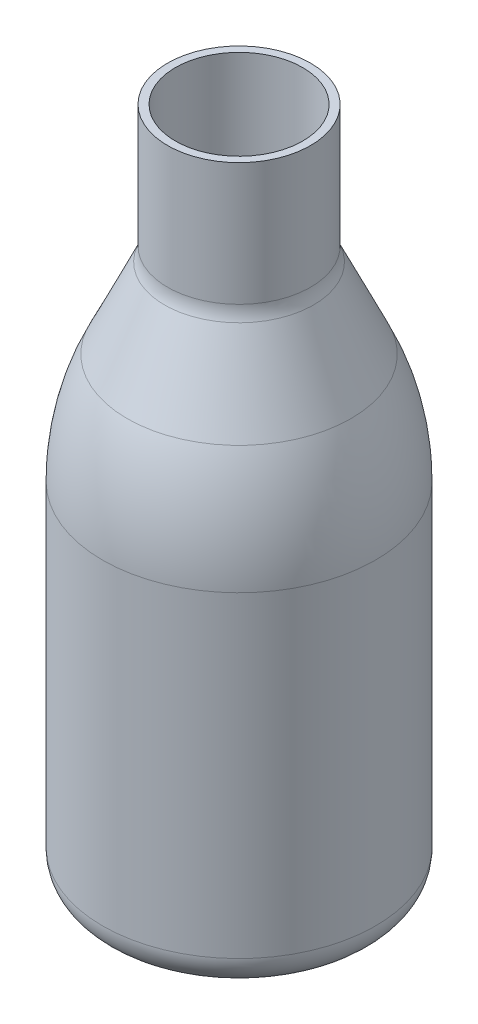
ISO-10303-21;
HEADER;
FILE_DESCRIPTION(('STEP AP214'),'2;1');
FILE_NAME('part.step','',(''),(''),'','','');
FILE_SCHEMA(('AUTOMOTIVE_DESIGN { 1 0 10303 214 1 1 1 1 }'));
ENDSEC;
DATA;
#1=APPLICATION_CONTEXT('core data for automotive mechanical design processes');
#2=APPLICATION_PROTOCOL_DEFINITION('international standard','automotive_design',2000,#1);
#3=PRODUCT_CONTEXT('',#1,'mechanical');
#4=PRODUCT('Part','Part','',(#3));
#5=PRODUCT_RELATED_PRODUCT_CATEGORY('part','',(#4));
#6=PRODUCT_DEFINITION_FORMATION('','',#4);
#7=PRODUCT_DEFINITION_CONTEXT('part definition',#1,'design');
#8=PRODUCT_DEFINITION('design','',#6,#7);
#9=PRODUCT_DEFINITION_SHAPE('','',#8);
#10=(LENGTH_UNIT() NAMED_UNIT(*) SI_UNIT(.MILLI.,.METRE.));
#11=(NAMED_UNIT(*) PLANE_ANGLE_UNIT() SI_UNIT($,.RADIAN.));
#12=(NAMED_UNIT(*) SI_UNIT($,.STERADIAN.) SOLID_ANGLE_UNIT());
#13=UNCERTAINTY_MEASURE_WITH_UNIT(LENGTH_MEASURE(1.E-05),#10,'distance_accuracy_value','');
#14=(GEOMETRIC_REPRESENTATION_CONTEXT(3) GLOBAL_UNCERTAINTY_ASSIGNED_CONTEXT((#13)) GLOBAL_UNIT_ASSIGNED_CONTEXT((#10,
#11,#12)) REPRESENTATION_CONTEXT('',''));
#15=CARTESIAN_POINT('',(0.,0.,0.));
#16=DIRECTION('',(0.,0.,1.));
#17=DIRECTION('',(1.,0.,0.));
#18=AXIS2_PLACEMENT_3D('',#15,#16,#17);
#19=CARTESIAN_POINT('',(0.,0.,0.));
#20=DIRECTION('',(0.,1.,0.));
#21=DIRECTION('',(0.,0.,1.));
#22=AXIS2_PLACEMENT_3D('',#19,#20,#21);
#23=PLANE('',#22);
#24=CARTESIAN_POINT('',(0.,0.,0.));
#25=DIRECTION('',(0.,1.,0.));
#26=DIRECTION('',(0.,0.,1.));
#27=AXIS2_PLACEMENT_3D('',#24,#25,#26);
#28=CIRCLE('',#27,20.32);
#29=CARTESIAN_POINT('',(0.,0.,20.32));
#30=VERTEX_POINT('',#29);
#31=EDGE_CURVE('E46',#30,#30,#28,.F.);
#32=ORIENTED_EDGE('',*,*,#31,.T.);
#33=EDGE_LOOP('',(#32));
#34=FACE_BOUND('',#33,.T.);
#35=ADVANCED_FACE('F31',(#34),#23,.F.);
#36=CARTESIAN_POINT('',(0.,0.,0.));
#37=DIRECTION('',(0.,-1.,0.));
#38=DIRECTION('',(0.,0.,-1.));
#39=AXIS2_PLACEMENT_3D('',#36,#37,#38);
#40=CYLINDRICAL_SURFACE('',#39,26.67);
#41=CARTESIAN_POINT('',(0.,68.2635948565817,0.));
#42=DIRECTION('',(0.,1.,0.));
#43=DIRECTION('',(0.,0.,1.));
#44=AXIS2_PLACEMENT_3D('',#41,#42,#43);
#45=CIRCLE('',#44,26.67);
#46=CARTESIAN_POINT('',(0.,68.2635948565817,26.67));
#47=VERTEX_POINT('',#46);
#48=EDGE_CURVE('E38',#47,#47,#45,.F.);
#49=ORIENTED_EDGE('',*,*,#48,.T.);
#50=EDGE_LOOP('',(#49));
#51=FACE_BOUND('',#50,.T.);
#52=CARTESIAN_POINT('',(0.,6.35,0.));
#53=DIRECTION('',(0.,1.,0.));
#54=DIRECTION('',(0.,0.,1.));
#55=AXIS2_PLACEMENT_3D('',#52,#53,#54);
#56=CIRCLE('',#55,26.67);
#57=CARTESIAN_POINT('',(0.,6.35,26.67));
#58=VERTEX_POINT('',#57);
#59=EDGE_CURVE('E42',#58,#58,#56,.T.);
#60=ORIENTED_EDGE('',*,*,#59,.T.);
#61=EDGE_LOOP('',(#60));
#62=FACE_BOUND('',#61,.T.);
#63=ADVANCED_FACE('F98',(#51,#62),#40,.T.);
#64=CARTESIAN_POINT('',(0.,106.68,0.));
#65=DIRECTION('',(0.,-1.,0.));
#66=DIRECTION('',(0.,0.,-1.));
#67=AXIS2_PLACEMENT_3D('',#64,#65,#66);
#68=CONICAL_SURFACE('',#67,13.97,0.438164188023194);
#69=CARTESIAN_POINT('',(0.,89.816906807428,0.));
#70=DIRECTION('',(0.,1.,0.));
#71=DIRECTION('',(0.,0.,1.));
#72=AXIS2_PLACEMENT_3D('',#69,#70,#71);
#73=CIRCLE('',#72,21.8710298140108);
#74=CARTESIAN_POINT('',(0.,89.816906807428,21.8710298140108));
#75=VERTEX_POINT('',#74);
#76=EDGE_CURVE('E10',#75,#75,#73,.T.);
#77=ORIENTED_EDGE('',*,*,#76,.T.);
#78=EDGE_LOOP('',(#77));
#79=FACE_BOUND('',#78,.T.);
#80=CARTESIAN_POINT('',(0.,105.399700415963,0.));
#81=DIRECTION('',(0.,-1.,0.));
#82=DIRECTION('',(0.,0.,-1.));
#83=AXIS2_PLACEMENT_3D('',#80,#81,#82);
#84=CIRCLE('',#83,14.5698712732487);
#85=CARTESIAN_POINT('',(0.,105.399700415963,-14.5698712732487));
#86=VERTEX_POINT('',#85);
#87=EDGE_CURVE('E54',#86,#86,#84,.T.);
#88=ORIENTED_EDGE('',*,*,#87,.T.);
#89=EDGE_LOOP('',(#88));
#90=FACE_BOUND('',#89,.T.);
#91=ADVANCED_FACE('F104',(#79,#90),#68,.T.);
#92=CARTESIAN_POINT('',(0.,0.,0.));
#93=DIRECTION('',(0.,-1.,0.));
#94=DIRECTION('',(0.,0.,-1.));
#95=AXIS2_PLACEMENT_3D('',#92,#93,#94);
#96=CYLINDRICAL_SURFACE('',#95,13.97);
#97=CARTESIAN_POINT('',(0.,108.093864409819,0.));
#98=DIRECTION('',(0.,-1.,0.));
#99=DIRECTION('',(0.,0.,-1.));
#100=AXIS2_PLACEMENT_3D('',#97,#98,#99);
#101=CIRCLE('',#100,13.97);
#102=CARTESIAN_POINT('',(0.,108.093864409819,-13.97));
#103=VERTEX_POINT('',#102);
#104=EDGE_CURVE('E51',#103,#103,#101,.F.);
#105=ORIENTED_EDGE('',*,*,#104,.T.);
#106=EDGE_LOOP('',(#105));
#107=FACE_BOUND('',#106,.T.);
#108=CARTESIAN_POINT('',(0.,132.08,0.));
#109=DIRECTION('',(0.,-1.,0.));
#110=DIRECTION('',(0.,0.,-1.));
#111=AXIS2_PLACEMENT_3D('',#108,#109,#110);
#112=CIRCLE('',#111,13.97);
#113=CARTESIAN_POINT('',(0.,132.08,-13.97));
#114=VERTEX_POINT('',#113);
#115=EDGE_CURVE('E57',#114,#114,#112,.T.);
#116=ORIENTED_EDGE('',*,*,#115,.T.);
#117=EDGE_LOOP('',(#116));
#118=FACE_BOUND('',#117,.T.);
#119=ADVANCED_FACE('F140',(#107,#118),#96,.T.);
#120=CARTESIAN_POINT('',(-13.97,132.08,0.));
#121=DIRECTION('',(0.,-1.,0.));
#122=DIRECTION('',(0.,0.,-1.));
#123=AXIS2_PLACEMENT_3D('',#120,#121,#122);
#124=PLANE('',#123);
#125=CARTESIAN_POINT('',(0.,132.08,0.));
#126=DIRECTION('',(0.,-1.,0.));
#127=DIRECTION('',(0.,0.,-1.));
#128=AXIS2_PLACEMENT_3D('',#125,#126,#127);
#129=CIRCLE('',#128,12.446);
#130=CARTESIAN_POINT('',(0.,132.08,-12.446));
#131=VERTEX_POINT('',#130);
#132=EDGE_CURVE('E61',#131,#131,#129,.T.);
#133=ORIENTED_EDGE('',*,*,#132,.T.);
#134=EDGE_LOOP('',(#133));
#135=FACE_BOUND('',#134,.T.);
#136=ORIENTED_EDGE('',*,*,#115,.F.);
#137=EDGE_LOOP('',(#136));
#138=FACE_BOUND('',#137,.T.);
#139=ADVANCED_FACE('F110',(#135,#138),#124,.F.);
#140=CARTESIAN_POINT('',(0.,108.093864409819,0.));
#141=DIRECTION('',(0.,-1.,0.));
#142=DIRECTION('',(0.,0.,-1.));
#143=AXIS2_PLACEMENT_3D('',#140,#141,#142);
#144=TOROIDAL_SURFACE('',#143,20.32,6.35);
#145=ORIENTED_EDGE('',*,*,#104,.F.);
#146=EDGE_LOOP('',(#145));
#147=FACE_BOUND('',#146,.T.);
#148=ORIENTED_EDGE('',*,*,#87,.F.);
#149=EDGE_LOOP('',(#148));
#150=FACE_BOUND('',#149,.T.);
#151=ADVANCED_FACE('F108',(#147,#150),#144,.F.);
#152=CARTESIAN_POINT('',(0.,6.35,0.));
#153=DIRECTION('',(0.,1.,0.));
#154=DIRECTION('',(0.,0.,1.));
#155=AXIS2_PLACEMENT_3D('',#152,#153,#154);
#156=TOROIDAL_SURFACE('',#155,20.32,6.35);
#157=ORIENTED_EDGE('',*,*,#59,.F.);
#158=EDGE_LOOP('',(#157));
#159=FACE_BOUND('',#158,.T.);
#160=ORIENTED_EDGE('',*,*,#31,.F.);
#161=EDGE_LOOP('',(#160));
#162=FACE_BOUND('',#161,.T.);
#163=ADVANCED_FACE('F95',(#159,#162),#156,.T.);
#164=CARTESIAN_POINT('',(0.,68.2635948565817,0.));
#165=DIRECTION('',(0.,1.,0.));
#166=DIRECTION('',(0.,0.,1.));
#167=AXIS2_PLACEMENT_3D('',#164,#165,#166);
#168=DEGENERATE_TOROIDAL_SURFACE('',#167,24.13,50.8,.F.);
#169=ORIENTED_EDGE('',*,*,#76,.F.);
#170=EDGE_LOOP('',(#169));
#171=FACE_BOUND('',#170,.T.);
#172=ORIENTED_EDGE('',*,*,#48,.F.);
#173=EDGE_LOOP('',(#172));
#174=FACE_BOUND('',#173,.T.);
#175=ADVANCED_FACE('F33',(#171,#174),#168,.F.);
#176=CARTESIAN_POINT('',(0.,1.524,0.));
#177=DIRECTION('',(0.,1.,0.));
#178=DIRECTION('',(0.,0.,1.));
#179=AXIS2_PLACEMENT_3D('',#176,#177,#178);
#180=PLANE('',#179);
#181=CARTESIAN_POINT('',(0.,1.524,0.));
#182=DIRECTION('',(0.,1.,0.));
#183=DIRECTION('',(0.,0.,1.));
#184=AXIS2_PLACEMENT_3D('',#181,#182,#183);
#185=CIRCLE('',#184,20.32);
#186=CARTESIAN_POINT('',(0.,1.524,20.32));
#187=VERTEX_POINT('',#186);
#188=EDGE_CURVE('E68',#187,#187,#185,.F.);
#189=ORIENTED_EDGE('',*,*,#188,.F.);
#190=EDGE_LOOP('',(#189));
#191=FACE_BOUND('',#190,.T.);
#192=ADVANCED_FACE('F84',(#191),#180,.T.);
#193=CARTESIAN_POINT('',(0.,0.,0.));
#194=DIRECTION('',(0.,-1.,0.));
#195=DIRECTION('',(0.,0.,-1.));
#196=AXIS2_PLACEMENT_3D('',#193,#194,#195);
#197=CYLINDRICAL_SURFACE('',#196,25.146);
#198=CARTESIAN_POINT('',(0.,68.2635948565817,0.));
#199=DIRECTION('',(0.,-1.,0.));
#200=DIRECTION('',(0.,0.,-1.));
#201=AXIS2_PLACEMENT_3D('',#198,#199,#200);
#202=CIRCLE('',#201,25.146);
#203=CARTESIAN_POINT('',(0.,68.2635948565817,-25.146));
#204=VERTEX_POINT('',#203);
#205=EDGE_CURVE('E73',#204,#204,#202,.T.);
#206=ORIENTED_EDGE('',*,*,#205,.F.);
#207=EDGE_LOOP('',(#206));
#208=FACE_BOUND('',#207,.T.);
#209=CARTESIAN_POINT('',(0.,6.35,0.));
#210=DIRECTION('',(0.,-1.,0.));
#211=DIRECTION('',(0.,0.,-1.));
#212=AXIS2_PLACEMENT_3D('',#209,#210,#211);
#213=CIRCLE('',#212,25.146);
#214=CARTESIAN_POINT('',(0.,6.35,-25.146));
#215=VERTEX_POINT('',#214);
#216=EDGE_CURVE('E76',#215,#215,#213,.F.);
#217=ORIENTED_EDGE('',*,*,#216,.F.);
#218=EDGE_LOOP('',(#217));
#219=FACE_BOUND('',#218,.T.);
#220=ADVANCED_FACE('F86',(#208,#219),#197,.F.);
#221=CARTESIAN_POINT('',(0.,106.033400641475,0.));
#222=DIRECTION('',(0.,-1.,0.));
#223=DIRECTION('',(0.,0.,-1.));
#224=AXIS2_PLACEMENT_3D('',#221,#222,#223);
#225=CONICAL_SURFACE('',#224,12.5899691055797,0.438164188023194);
#226=CARTESIAN_POINT('',(0.,89.1703074489026,0.));
#227=DIRECTION('',(0.,-1.,0.));
#228=DIRECTION('',(0.,0.,-1.));
#229=AXIS2_PLACEMENT_3D('',#226,#227,#228);
#230=CIRCLE('',#229,20.4909989195904);
#231=CARTESIAN_POINT('',(0.,89.1703074489026,-20.4909989195904));
#232=VERTEX_POINT('',#231);
#233=EDGE_CURVE('E60',#232,#232,#230,.F.);
#234=ORIENTED_EDGE('',*,*,#233,.F.);
#235=EDGE_LOOP('',(#234));
#236=FACE_BOUND('',#235,.T.);
#237=CARTESIAN_POINT('',(0.,104.753101057438,0.));
#238=DIRECTION('',(0.,-1.,0.));
#239=DIRECTION('',(0.,0.,-1.));
#240=AXIS2_PLACEMENT_3D('',#237,#238,#239);
#241=CIRCLE('',#240,13.1898403788283);
#242=CARTESIAN_POINT('',(0.,104.753101057438,-13.1898403788283));
#243=VERTEX_POINT('',#242);
#244=EDGE_CURVE('E64',#243,#243,#241,.T.);
#245=ORIENTED_EDGE('',*,*,#244,.F.);
#246=EDGE_LOOP('',(#245));
#247=FACE_BOUND('',#246,.T.);
#248=ADVANCED_FACE('F92',(#236,#247),#225,.F.);
#249=CARTESIAN_POINT('',(0.,0.,0.));
#250=DIRECTION('',(0.,-1.,0.));
#251=DIRECTION('',(0.,0.,-1.));
#252=AXIS2_PLACEMENT_3D('',#249,#250,#251);
#253=CYLINDRICAL_SURFACE('',#252,12.446);
#254=CARTESIAN_POINT('',(0.,108.093864409819,0.));
#255=DIRECTION('',(0.,-1.,0.));
#256=DIRECTION('',(0.,0.,-1.));
#257=AXIS2_PLACEMENT_3D('',#254,#255,#256);
#258=CIRCLE('',#257,12.446);
#259=CARTESIAN_POINT('',(0.,108.093864409819,-12.446));
#260=VERTEX_POINT('',#259);
#261=EDGE_CURVE('E65',#260,#260,#258,.F.);
#262=ORIENTED_EDGE('',*,*,#261,.F.);
#263=EDGE_LOOP('',(#262));
#264=FACE_BOUND('',#263,.T.);
#265=ORIENTED_EDGE('',*,*,#132,.F.);
#266=EDGE_LOOP('',(#265));
#267=FACE_BOUND('',#266,.T.);
#268=ADVANCED_FACE('F163',(#264,#267),#253,.F.);
#269=CARTESIAN_POINT('',(0.,108.093864409819,0.));
#270=DIRECTION('',(0.,-1.,0.));
#271=DIRECTION('',(0.,0.,-1.));
#272=AXIS2_PLACEMENT_3D('',#269,#270,#271);
#273=TOROIDAL_SURFACE('',#272,20.32,7.874);
#274=ORIENTED_EDGE('',*,*,#261,.T.);
#275=EDGE_LOOP('',(#274));
#276=FACE_BOUND('',#275,.T.);
#277=ORIENTED_EDGE('',*,*,#244,.T.);
#278=EDGE_LOOP('',(#277));
#279=FACE_BOUND('',#278,.T.);
#280=ADVANCED_FACE('F173',(#276,#279),#273,.T.);
#281=CARTESIAN_POINT('',(0.,6.35,0.));
#282=DIRECTION('',(0.,1.,0.));
#283=DIRECTION('',(0.,0.,1.));
#284=AXIS2_PLACEMENT_3D('',#281,#282,#283);
#285=TOROIDAL_SURFACE('',#284,20.32,4.826);
#286=ORIENTED_EDGE('',*,*,#216,.T.);
#287=EDGE_LOOP('',(#286));
#288=FACE_BOUND('',#287,.T.);
#289=ORIENTED_EDGE('',*,*,#188,.T.);
#290=EDGE_LOOP('',(#289));
#291=FACE_BOUND('',#290,.T.);
#292=ADVANCED_FACE('F82',(#288,#291),#285,.F.);
#293=CARTESIAN_POINT('',(0.,68.2635948565817,0.));
#294=DIRECTION('',(0.,1.,0.));
#295=DIRECTION('',(0.,0.,1.));
#296=AXIS2_PLACEMENT_3D('',#293,#294,#295);
#297=DEGENERATE_TOROIDAL_SURFACE('',#296,24.13,49.276,.F.);
#298=ORIENTED_EDGE('',*,*,#233,.T.);
#299=EDGE_LOOP('',(#298));
#300=FACE_BOUND('',#299,.T.);
#301=ORIENTED_EDGE('',*,*,#205,.T.);
#302=EDGE_LOOP('',(#301));
#303=FACE_BOUND('',#302,.T.);
#304=ADVANCED_FACE('F192',(#300,#303),#297,.T.);
#305=CLOSED_SHELL('',(#35,#63,#91,#119,#139,#151,#163,#175,#192,#220,#248,#268,#280,#292,#304));
#306=MANIFOLD_SOLID_BREP('B2',#305);
#307=ADVANCED_BREP_SHAPE_REPRESENTATION('',(#18,#306),#14);
#308=SHAPE_DEFINITION_REPRESENTATION(#9,#307);
ENDSEC;
END-ISO-10303-21;
